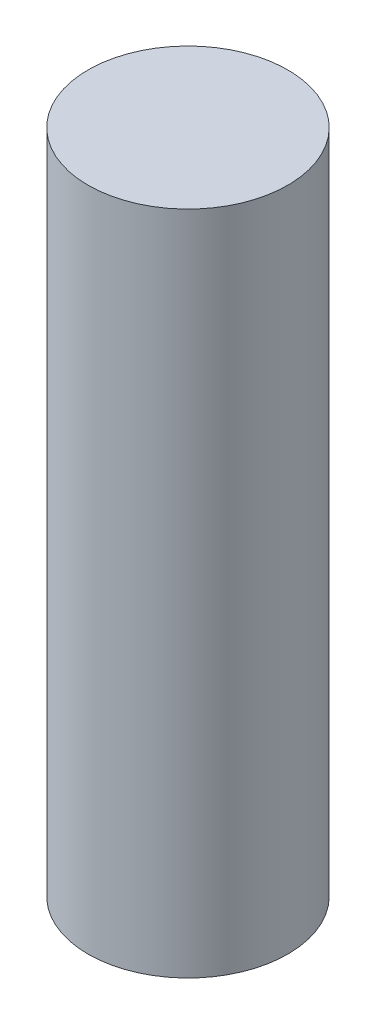
ISO-10303-21;
HEADER;
FILE_DESCRIPTION(('STEP AP214'),'2;1');
FILE_NAME('part.step','',(''),(''),'','','');
FILE_SCHEMA(('AUTOMOTIVE_DESIGN { 1 0 10303 214 1 1 1 1 }'));
ENDSEC;
DATA;
#1=APPLICATION_CONTEXT('core data for automotive mechanical design processes');
#2=APPLICATION_PROTOCOL_DEFINITION('international standard','automotive_design',2000,#1);
#3=PRODUCT_CONTEXT('',#1,'mechanical');
#4=PRODUCT('Part','Part','',(#3));
#5=PRODUCT_RELATED_PRODUCT_CATEGORY('part','',(#4));
#6=PRODUCT_DEFINITION_FORMATION('','',#4);
#7=PRODUCT_DEFINITION_CONTEXT('part definition',#1,'design');
#8=PRODUCT_DEFINITION('design','',#6,#7);
#9=PRODUCT_DEFINITION_SHAPE('','',#8);
#10=(LENGTH_UNIT() NAMED_UNIT(*) SI_UNIT(.MILLI.,.METRE.));
#11=(NAMED_UNIT(*) PLANE_ANGLE_UNIT() SI_UNIT($,.RADIAN.));
#12=(NAMED_UNIT(*) SI_UNIT($,.STERADIAN.) SOLID_ANGLE_UNIT());
#13=UNCERTAINTY_MEASURE_WITH_UNIT(LENGTH_MEASURE(1.E-05),#10,'distance_accuracy_value','');
#14=(GEOMETRIC_REPRESENTATION_CONTEXT(3) GLOBAL_UNCERTAINTY_ASSIGNED_CONTEXT((#13)) GLOBAL_UNIT_ASSIGNED_CONTEXT((#10,
#11,#12)) REPRESENTATION_CONTEXT('',''));
#15=CARTESIAN_POINT('',(0.,0.,0.));
#16=DIRECTION('',(0.,0.,1.));
#17=DIRECTION('',(1.,0.,0.));
#18=AXIS2_PLACEMENT_3D('',#15,#16,#17);
#19=CARTESIAN_POINT('',(0.,1000.,0.));
#20=DIRECTION('',(0.,-1.,0.));
#21=DIRECTION('',(0.,0.,-1.));
#22=AXIS2_PLACEMENT_3D('',#19,#20,#21);
#23=CYLINDRICAL_SURFACE('',#22,150.);
#24=CARTESIAN_POINT('',(0.,1000.,0.));
#25=DIRECTION('',(0.,1.,0.));
#26=DIRECTION('',(0.,0.,1.));
#27=AXIS2_PLACEMENT_3D('',#24,#25,#26);
#28=CIRCLE('',#27,150.);
#29=CARTESIAN_POINT('',(0.,1000.,150.));
#30=VERTEX_POINT('',#29);
#31=EDGE_CURVE('E10',#30,#30,#28,.T.);
#32=ORIENTED_EDGE('',*,*,#31,.F.);
#33=EDGE_LOOP('',(#32));
#34=FACE_BOUND('',#33,.T.);
#35=CARTESIAN_POINT('',(0.,0.,0.));
#36=DIRECTION('',(0.,1.,0.));
#37=DIRECTION('',(0.,0.,1.));
#38=AXIS2_PLACEMENT_3D('',#35,#36,#37);
#39=CIRCLE('',#38,150.);
#40=CARTESIAN_POINT('',(0.,0.,150.));
#41=VERTEX_POINT('',#40);
#42=EDGE_CURVE('E42',#41,#41,#39,.T.);
#43=ORIENTED_EDGE('',*,*,#42,.T.);
#44=EDGE_LOOP('',(#43));
#45=FACE_BOUND('',#44,.T.);
#46=ADVANCED_FACE('F39',(#34,#45),#23,.T.);
#47=CARTESIAN_POINT('',(0.,1000.,0.));
#48=DIRECTION('',(0.,1.,0.));
#49=DIRECTION('',(0.,0.,1.));
#50=AXIS2_PLACEMENT_3D('',#47,#48,#49);
#51=PLANE('',#50);
#52=ORIENTED_EDGE('',*,*,#31,.T.);
#53=EDGE_LOOP('',(#52));
#54=FACE_BOUND('',#53,.T.);
#55=ADVANCED_FACE('F54',(#54),#51,.T.);
#56=CARTESIAN_POINT('',(0.,0.,0.));
#57=DIRECTION('',(0.,1.,0.));
#58=DIRECTION('',(0.,0.,1.));
#59=AXIS2_PLACEMENT_3D('',#56,#57,#58);
#60=PLANE('',#59);
#61=ORIENTED_EDGE('',*,*,#42,.F.);
#62=EDGE_LOOP('',(#61));
#63=FACE_BOUND('',#62,.T.);
#64=ADVANCED_FACE('F52',(#63),#60,.F.);
#65=CLOSED_SHELL('',(#46,#55,#64));
#66=MANIFOLD_SOLID_BREP('B2',#65);
#67=ADVANCED_BREP_SHAPE_REPRESENTATION('',(#18,#66),#14);
#68=SHAPE_DEFINITION_REPRESENTATION(#9,#67);
ENDSEC;
END-ISO-10303-21;
